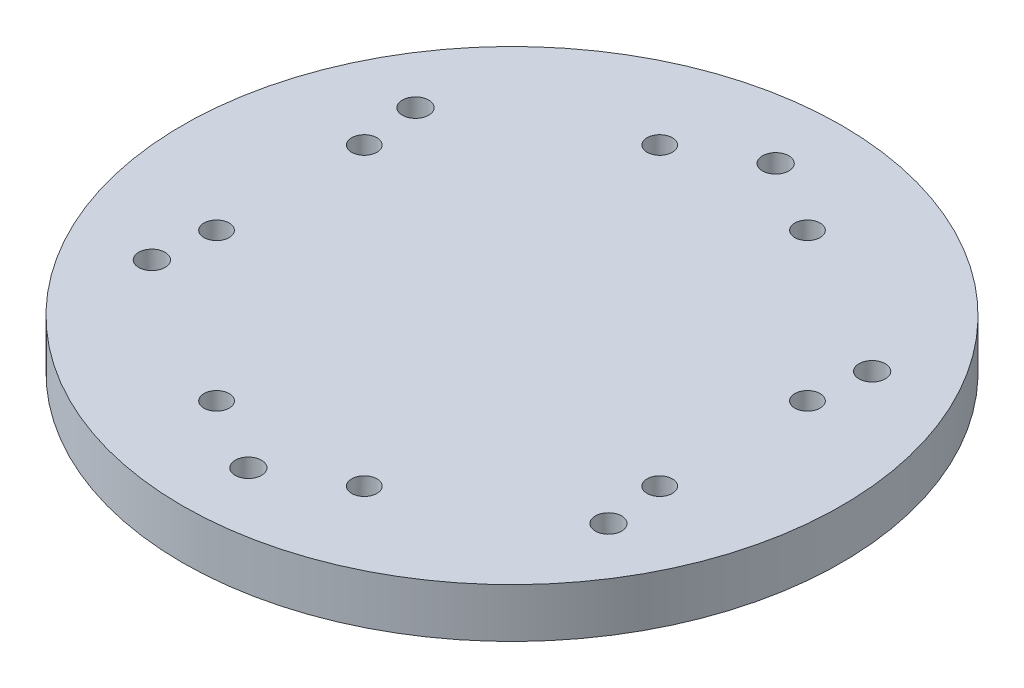
ISO-10303-21;
HEADER;
FILE_DESCRIPTION(('STEP AP214'),'2;1');
FILE_NAME('part.step','',(''),(''),'','','');
FILE_SCHEMA(('AUTOMOTIVE_DESIGN { 1 0 10303 214 1 1 1 1 }'));
ENDSEC;
DATA;
#1=APPLICATION_CONTEXT('core data for automotive mechanical design processes');
#2=APPLICATION_PROTOCOL_DEFINITION('international standard','automotive_design',2000,#1);
#3=PRODUCT_CONTEXT('',#1,'mechanical');
#4=PRODUCT('Part','Part','',(#3));
#5=PRODUCT_RELATED_PRODUCT_CATEGORY('part','',(#4));
#6=PRODUCT_DEFINITION_FORMATION('','',#4);
#7=PRODUCT_DEFINITION_CONTEXT('part definition',#1,'design');
#8=PRODUCT_DEFINITION('design','',#6,#7);
#9=PRODUCT_DEFINITION_SHAPE('','',#8);
#10=(LENGTH_UNIT() NAMED_UNIT(*) SI_UNIT(.MILLI.,.METRE.));
#11=(NAMED_UNIT(*) PLANE_ANGLE_UNIT() SI_UNIT($,.RADIAN.));
#12=(NAMED_UNIT(*) SI_UNIT($,.STERADIAN.) SOLID_ANGLE_UNIT());
#13=UNCERTAINTY_MEASURE_WITH_UNIT(LENGTH_MEASURE(1.E-05),#10,'distance_accuracy_value','');
#14=(GEOMETRIC_REPRESENTATION_CONTEXT(3) GLOBAL_UNCERTAINTY_ASSIGNED_CONTEXT((#13)) GLOBAL_UNIT_ASSIGNED_CONTEXT((#10,
#11,#12)) REPRESENTATION_CONTEXT('',''));
#15=CARTESIAN_POINT('',(0.,0.,0.));
#16=DIRECTION('',(0.,0.,1.));
#17=DIRECTION('',(1.,0.,0.));
#18=AXIS2_PLACEMENT_3D('',#15,#16,#17);
#19=CARTESIAN_POINT('',(0.,12.7,0.));
#20=DIRECTION('',(0.,1.,0.));
#21=DIRECTION('',(0.,0.,1.));
#22=AXIS2_PLACEMENT_3D('',#19,#20,#21);
#23=PLANE('',#22);
#24=CARTESIAN_POINT('',(0.,12.7,0.));
#25=DIRECTION('',(0.,1.,0.));
#26=DIRECTION('',(0.,0.,1.));
#27=AXIS2_PLACEMENT_3D('',#24,#25,#26);
#28=CIRCLE('',#27,85.);
#29=CARTESIAN_POINT('',(0.,12.7,85.));
#30=VERTEX_POINT('',#29);
#31=EDGE_CURVE('E10',#30,#30,#28,.T.);
#32=ORIENTED_EDGE('',*,*,#31,.T.);
#33=EDGE_LOOP('',(#32));
#34=FACE_BOUND('',#33,.T.);
#35=CARTESIAN_POINT('',(0.,12.7,-68.));
#36=DIRECTION('',(0.,1.,0.));
#37=DIRECTION('',(0.,0.,1.));
#38=AXIS2_PLACEMENT_3D('',#35,#36,#37);
#39=CIRCLE('',#38,3.4);
#40=CARTESIAN_POINT('',(0.,12.7,-64.6));
#41=VERTEX_POINT('',#40);
#42=EDGE_CURVE('E50',#41,#41,#39,.T.);
#43=ORIENTED_EDGE('',*,*,#42,.F.);
#44=EDGE_LOOP('',(#43));
#45=FACE_BOUND('',#44,.T.);
#46=CARTESIAN_POINT('',(58.8897274573419,12.7,-33.9999999999999));
#47=DIRECTION('',(0.,1.,0.));
#48=DIRECTION('',(-0.86602540378444,0.,0.499999999999998));
#49=AXIS2_PLACEMENT_3D('',#46,#47,#48);
#50=CIRCLE('',#49,3.4);
#51=CARTESIAN_POINT('',(55.9452410844748,12.7,-32.2999999999999));
#52=VERTEX_POINT('',#51);
#53=EDGE_CURVE('E53',#52,#52,#50,.T.);
#54=ORIENTED_EDGE('',*,*,#53,.F.);
#55=EDGE_LOOP('',(#54));
#56=FACE_BOUND('',#55,.T.);
#57=CARTESIAN_POINT('',(58.8897274573417,12.7,34.0000000000003));
#58=DIRECTION('',(0.,1.,0.));
#59=DIRECTION('',(-0.866025403784436,0.,-0.500000000000004));
#60=AXIS2_PLACEMENT_3D('',#57,#58,#59);
#61=CIRCLE('',#60,3.4);
#62=CARTESIAN_POINT('',(55.9452410844746,12.7,32.3000000000003));
#63=VERTEX_POINT('',#62);
#64=EDGE_CURVE('E59',#63,#63,#61,.T.);
#65=ORIENTED_EDGE('',*,*,#64,.F.);
#66=EDGE_LOOP('',(#65));
#67=FACE_BOUND('',#66,.T.);
#68=CARTESIAN_POINT('',(0.,12.7,68.));
#69=DIRECTION('',(0.,1.,0.));
#70=DIRECTION('',(0.,0.,-1.));
#71=AXIS2_PLACEMENT_3D('',#68,#69,#70);
#72=CIRCLE('',#71,3.4);
#73=CARTESIAN_POINT('',(0.,12.7,64.6));
#74=VERTEX_POINT('',#73);
#75=EDGE_CURVE('E74',#74,#74,#72,.T.);
#76=ORIENTED_EDGE('',*,*,#75,.F.);
#77=EDGE_LOOP('',(#76));
#78=FACE_BOUND('',#77,.T.);
#79=CARTESIAN_POINT('',(-58.8897274573421,12.7,33.9999999999995));
#80=DIRECTION('',(0.,1.,0.));
#81=DIRECTION('',(0.866025403784443,0.,-0.499999999999992));
#82=AXIS2_PLACEMENT_3D('',#79,#80,#81);
#83=CIRCLE('',#82,3.4);
#84=CARTESIAN_POINT('',(-55.945241084475,12.7,32.2999999999995));
#85=VERTEX_POINT('',#84);
#86=EDGE_CURVE('E68',#85,#85,#83,.T.);
#87=ORIENTED_EDGE('',*,*,#86,.F.);
#88=EDGE_LOOP('',(#87));
#89=FACE_BOUND('',#88,.T.);
#90=CARTESIAN_POINT('',(-58.8897274573414,12.7,-34.0000000000007));
#91=DIRECTION('',(0.,1.,0.));
#92=DIRECTION('',(0.866025403784433,0.,0.50000000000001));
#93=AXIS2_PLACEMENT_3D('',#90,#91,#92);
#94=CIRCLE('',#93,3.4);
#95=CARTESIAN_POINT('',(-55.9452410844744,12.7,-32.3000000000007));
#96=VERTEX_POINT('',#95);
#97=EDGE_CURVE('E60',#96,#96,#94,.T.);
#98=ORIENTED_EDGE('',*,*,#97,.F.);
#99=EDGE_LOOP('',(#98));
#100=FACE_BOUND('',#99,.T.);
#101=CARTESIAN_POINT('',(-19.0499999994334,12.7,-57.1499999999971));
#102=DIRECTION('',(0.,-1.,0.));
#103=DIRECTION('',(0.,0.,-1.));
#104=AXIS2_PLACEMENT_3D('',#101,#102,#103);
#105=CIRCLE('',#104,3.2639);
#106=CARTESIAN_POINT('',(-19.0499999994334,12.7,-60.4138999999971));
#107=VERTEX_POINT('',#106);
#108=EDGE_CURVE('E67',#107,#107,#105,.T.);
#109=ORIENTED_EDGE('',*,*,#108,.T.);
#110=EDGE_LOOP('',(#109));
#111=FACE_BOUND('',#110,.T.);
#112=CARTESIAN_POINT('',(19.0499999994334,12.7,-57.1499999999971));
#113=DIRECTION('',(0.,-1.,0.));
#114=DIRECTION('',(0.,0.,-1.));
#115=AXIS2_PLACEMENT_3D('',#112,#113,#114);
#116=CIRCLE('',#115,3.2639);
#117=CARTESIAN_POINT('',(19.0499999994334,12.7,-60.4138999999971));
#118=VERTEX_POINT('',#117);
#119=EDGE_CURVE('E89',#118,#118,#116,.T.);
#120=ORIENTED_EDGE('',*,*,#119,.T.);
#121=EDGE_LOOP('',(#120));
#122=FACE_BOUND('',#121,.T.);
#123=CARTESIAN_POINT('',(57.1499999999972,12.7,-19.0499999994332));
#124=DIRECTION('',(0.,-1.,0.));
#125=DIRECTION('',(0.,0.,-1.));
#126=AXIS2_PLACEMENT_3D('',#123,#124,#125);
#127=CIRCLE('',#126,3.2639);
#128=CARTESIAN_POINT('',(57.1499999999972,12.7,-22.3138999994332));
#129=VERTEX_POINT('',#128);
#130=EDGE_CURVE('E95',#129,#129,#127,.T.);
#131=ORIENTED_EDGE('',*,*,#130,.T.);
#132=EDGE_LOOP('',(#131));
#133=FACE_BOUND('',#132,.T.);
#134=CARTESIAN_POINT('',(57.1499999999971,12.7,19.0499999994336));
#135=DIRECTION('',(0.,-1.,0.));
#136=DIRECTION('',(0.,0.,-1.));
#137=AXIS2_PLACEMENT_3D('',#134,#135,#136);
#138=CIRCLE('',#137,3.2639);
#139=CARTESIAN_POINT('',(57.1499999999971,12.7,15.7860999994336));
#140=VERTEX_POINT('',#139);
#141=EDGE_CURVE('E101',#140,#140,#138,.T.);
#142=ORIENTED_EDGE('',*,*,#141,.T.);
#143=EDGE_LOOP('',(#142));
#144=FACE_BOUND('',#143,.T.);
#145=CARTESIAN_POINT('',(19.0499999994334,12.7,57.1499999999971));
#146=DIRECTION('',(0.,-1.,0.));
#147=DIRECTION('',(0.,0.,-1.));
#148=AXIS2_PLACEMENT_3D('',#145,#146,#147);
#149=CIRCLE('',#148,3.2639);
#150=CARTESIAN_POINT('',(19.0499999994334,12.7,53.8860999999971));
#151=VERTEX_POINT('',#150);
#152=EDGE_CURVE('E107',#151,#151,#149,.T.);
#153=ORIENTED_EDGE('',*,*,#152,.T.);
#154=EDGE_LOOP('',(#153));
#155=FACE_BOUND('',#154,.T.);
#156=CARTESIAN_POINT('',(-19.0499999994334,12.7,57.1499999999971));
#157=DIRECTION('',(0.,-1.,0.));
#158=DIRECTION('',(0.,0.,-1.));
#159=AXIS2_PLACEMENT_3D('',#156,#157,#158);
#160=CIRCLE('',#159,3.2639);
#161=CARTESIAN_POINT('',(-19.0499999994334,12.7,53.8860999999971));
#162=VERTEX_POINT('',#161);
#163=EDGE_CURVE('E113',#162,#162,#160,.T.);
#164=ORIENTED_EDGE('',*,*,#163,.T.);
#165=EDGE_LOOP('',(#164));
#166=FACE_BOUND('',#165,.T.);
#167=CARTESIAN_POINT('',(-57.1499999999973,12.7,19.0499999994328));
#168=DIRECTION('',(0.,-1.,0.));
#169=DIRECTION('',(0.,0.,-1.));
#170=AXIS2_PLACEMENT_3D('',#167,#168,#169);
#171=CIRCLE('',#170,3.2639);
#172=CARTESIAN_POINT('',(-57.1499999999973,12.7,15.7860999994328));
#173=VERTEX_POINT('',#172);
#174=EDGE_CURVE('E119',#173,#173,#171,.T.);
#175=ORIENTED_EDGE('',*,*,#174,.T.);
#176=EDGE_LOOP('',(#175));
#177=FACE_BOUND('',#176,.T.);
#178=CARTESIAN_POINT('',(-57.1499999999969,12.7,-19.049999999434));
#179=DIRECTION('',(0.,-1.,0.));
#180=DIRECTION('',(0.,0.,-1.));
#181=AXIS2_PLACEMENT_3D('',#178,#179,#180);
#182=CIRCLE('',#181,3.2639);
#183=CARTESIAN_POINT('',(-57.1499999999969,12.7,-22.313899999434));
#184=VERTEX_POINT('',#183);
#185=EDGE_CURVE('E125',#184,#184,#182,.T.);
#186=ORIENTED_EDGE('',*,*,#185,.T.);
#187=EDGE_LOOP('',(#186));
#188=FACE_BOUND('',#187,.T.);
#189=ADVANCED_FACE('F35',(#34,#45,#56,#67,#78,#89,#100,#111,#122,#133,#144,#155,#166,#177,#188),
#23,.T.);
#190=CARTESIAN_POINT('',(0.,0.,0.));
#191=DIRECTION('',(0.,1.,0.));
#192=DIRECTION('',(0.,0.,1.));
#193=AXIS2_PLACEMENT_3D('',#190,#191,#192);
#194=PLANE('',#193);
#195=CARTESIAN_POINT('',(-57.1499999999973,0.,19.0499999994328));
#196=DIRECTION('',(0.,-1.,0.));
#197=DIRECTION('',(0.,0.,-1.));
#198=AXIS2_PLACEMENT_3D('',#195,#196,#197);
#199=CIRCLE('',#198,3.2639);
#200=CARTESIAN_POINT('',(-57.1499999999973,0.,15.7860999994328));
#201=VERTEX_POINT('',#200);
#202=EDGE_CURVE('E122',#201,#201,#199,.T.);
#203=ORIENTED_EDGE('',*,*,#202,.F.);
#204=EDGE_LOOP('',(#203));
#205=FACE_BOUND('',#204,.T.);
#206=CARTESIAN_POINT('',(-19.0499999994334,0.,57.1499999999971));
#207=DIRECTION('',(0.,-1.,0.));
#208=DIRECTION('',(0.,0.,-1.));
#209=AXIS2_PLACEMENT_3D('',#206,#207,#208);
#210=CIRCLE('',#209,3.2639);
#211=CARTESIAN_POINT('',(-19.0499999994334,0.,53.8860999999971));
#212=VERTEX_POINT('',#211);
#213=EDGE_CURVE('E116',#212,#212,#210,.T.);
#214=ORIENTED_EDGE('',*,*,#213,.F.);
#215=EDGE_LOOP('',(#214));
#216=FACE_BOUND('',#215,.T.);
#217=CARTESIAN_POINT('',(19.0499999994334,0.,57.1499999999971));
#218=DIRECTION('',(0.,-1.,0.));
#219=DIRECTION('',(0.,0.,-1.));
#220=AXIS2_PLACEMENT_3D('',#217,#218,#219);
#221=CIRCLE('',#220,3.2639);
#222=CARTESIAN_POINT('',(19.0499999994334,0.,53.8860999999971));
#223=VERTEX_POINT('',#222);
#224=EDGE_CURVE('E110',#223,#223,#221,.T.);
#225=ORIENTED_EDGE('',*,*,#224,.F.);
#226=EDGE_LOOP('',(#225));
#227=FACE_BOUND('',#226,.T.);
#228=CARTESIAN_POINT('',(57.1499999999971,0.,19.0499999994336));
#229=DIRECTION('',(0.,-1.,0.));
#230=DIRECTION('',(0.,0.,-1.));
#231=AXIS2_PLACEMENT_3D('',#228,#229,#230);
#232=CIRCLE('',#231,3.2639);
#233=CARTESIAN_POINT('',(57.1499999999971,0.,15.7860999994336));
#234=VERTEX_POINT('',#233);
#235=EDGE_CURVE('E104',#234,#234,#232,.T.);
#236=ORIENTED_EDGE('',*,*,#235,.F.);
#237=EDGE_LOOP('',(#236));
#238=FACE_BOUND('',#237,.T.);
#239=CARTESIAN_POINT('',(57.1499999999972,0.,-19.0499999994332));
#240=DIRECTION('',(0.,-1.,0.));
#241=DIRECTION('',(0.,0.,-1.));
#242=AXIS2_PLACEMENT_3D('',#239,#240,#241);
#243=CIRCLE('',#242,3.2639);
#244=CARTESIAN_POINT('',(57.1499999999972,0.,-22.3138999994332));
#245=VERTEX_POINT('',#244);
#246=EDGE_CURVE('E98',#245,#245,#243,.T.);
#247=ORIENTED_EDGE('',*,*,#246,.F.);
#248=EDGE_LOOP('',(#247));
#249=FACE_BOUND('',#248,.T.);
#250=CARTESIAN_POINT('',(19.0499999994334,0.,-57.1499999999971));
#251=DIRECTION('',(0.,-1.,0.));
#252=DIRECTION('',(0.,0.,-1.));
#253=AXIS2_PLACEMENT_3D('',#250,#251,#252);
#254=CIRCLE('',#253,3.2639);
#255=CARTESIAN_POINT('',(19.0499999994334,0.,-60.4138999999971));
#256=VERTEX_POINT('',#255);
#257=EDGE_CURVE('E92',#256,#256,#254,.T.);
#258=ORIENTED_EDGE('',*,*,#257,.F.);
#259=EDGE_LOOP('',(#258));
#260=FACE_BOUND('',#259,.T.);
#261=CARTESIAN_POINT('',(-19.0499999994334,0.,-57.1499999999971));
#262=DIRECTION('',(0.,-1.,0.));
#263=DIRECTION('',(0.,0.,-1.));
#264=AXIS2_PLACEMENT_3D('',#261,#262,#263);
#265=CIRCLE('',#264,3.2639);
#266=CARTESIAN_POINT('',(-19.0499999994334,0.,-60.4138999999971));
#267=VERTEX_POINT('',#266);
#268=EDGE_CURVE('E86',#267,#267,#265,.T.);
#269=ORIENTED_EDGE('',*,*,#268,.F.);
#270=EDGE_LOOP('',(#269));
#271=FACE_BOUND('',#270,.T.);
#272=CARTESIAN_POINT('',(-58.8897274573414,0.,-34.0000000000007));
#273=DIRECTION('',(0.,1.,0.));
#274=DIRECTION('',(0.866025403784433,0.,0.50000000000001));
#275=AXIS2_PLACEMENT_3D('',#272,#273,#274);
#276=CIRCLE('',#275,3.4);
#277=CARTESIAN_POINT('',(-55.9452410844744,0.,-32.3000000000007));
#278=VERTEX_POINT('',#277);
#279=EDGE_CURVE('E64',#278,#278,#276,.T.);
#280=ORIENTED_EDGE('',*,*,#279,.T.);
#281=EDGE_LOOP('',(#280));
#282=FACE_BOUND('',#281,.T.);
#283=CARTESIAN_POINT('',(-58.8897274573421,0.,33.9999999999995));
#284=DIRECTION('',(0.,1.,0.));
#285=DIRECTION('',(0.866025403784443,0.,-0.499999999999992));
#286=AXIS2_PLACEMENT_3D('',#283,#284,#285);
#287=CIRCLE('',#286,3.4);
#288=CARTESIAN_POINT('',(-55.945241084475,0.,32.2999999999995));
#289=VERTEX_POINT('',#288);
#290=EDGE_CURVE('E63',#289,#289,#287,.T.);
#291=ORIENTED_EDGE('',*,*,#290,.T.);
#292=EDGE_LOOP('',(#291));
#293=FACE_BOUND('',#292,.T.);
#294=CARTESIAN_POINT('',(0.,0.,68.));
#295=DIRECTION('',(0.,1.,0.));
#296=DIRECTION('',(0.,0.,-1.));
#297=AXIS2_PLACEMENT_3D('',#294,#295,#296);
#298=CIRCLE('',#297,3.4);
#299=CARTESIAN_POINT('',(0.,0.,64.6));
#300=VERTEX_POINT('',#299);
#301=EDGE_CURVE('E71',#300,#300,#298,.T.);
#302=ORIENTED_EDGE('',*,*,#301,.T.);
#303=EDGE_LOOP('',(#302));
#304=FACE_BOUND('',#303,.T.);
#305=CARTESIAN_POINT('',(58.8897274573417,0.,34.0000000000003));
#306=DIRECTION('',(0.,1.,0.));
#307=DIRECTION('',(-0.866025403784436,0.,-0.500000000000004));
#308=AXIS2_PLACEMENT_3D('',#305,#306,#307);
#309=CIRCLE('',#308,3.4);
#310=CARTESIAN_POINT('',(55.9452410844746,0.,32.3000000000003));
#311=VERTEX_POINT('',#310);
#312=EDGE_CURVE('E77',#311,#311,#309,.T.);
#313=ORIENTED_EDGE('',*,*,#312,.T.);
#314=EDGE_LOOP('',(#313));
#315=FACE_BOUND('',#314,.T.);
#316=CARTESIAN_POINT('',(58.8897274573419,0.,-33.9999999999999));
#317=DIRECTION('',(0.,1.,0.));
#318=DIRECTION('',(-0.86602540378444,0.,0.499999999999998));
#319=AXIS2_PLACEMENT_3D('',#316,#317,#318);
#320=CIRCLE('',#319,3.4);
#321=CARTESIAN_POINT('',(55.9452410844748,0.,-32.2999999999999));
#322=VERTEX_POINT('',#321);
#323=EDGE_CURVE('E56',#322,#322,#320,.T.);
#324=ORIENTED_EDGE('',*,*,#323,.T.);
#325=EDGE_LOOP('',(#324));
#326=FACE_BOUND('',#325,.T.);
#327=CARTESIAN_POINT('',(0.,0.,-68.));
#328=DIRECTION('',(0.,1.,0.));
#329=DIRECTION('',(0.,0.,1.));
#330=AXIS2_PLACEMENT_3D('',#327,#328,#329);
#331=CIRCLE('',#330,3.4);
#332=CARTESIAN_POINT('',(0.,0.,-64.6));
#333=VERTEX_POINT('',#332);
#334=EDGE_CURVE('E46',#333,#333,#331,.T.);
#335=ORIENTED_EDGE('',*,*,#334,.T.);
#336=EDGE_LOOP('',(#335));
#337=FACE_BOUND('',#336,.T.);
#338=CARTESIAN_POINT('',(0.,0.,0.));
#339=DIRECTION('',(0.,1.,0.));
#340=DIRECTION('',(0.,0.,1.));
#341=AXIS2_PLACEMENT_3D('',#338,#339,#340);
#342=CIRCLE('',#341,85.);
#343=CARTESIAN_POINT('',(0.,0.,85.));
#344=VERTEX_POINT('',#343);
#345=EDGE_CURVE('E39',#344,#344,#342,.T.);
#346=ORIENTED_EDGE('',*,*,#345,.F.);
#347=EDGE_LOOP('',(#346));
#348=FACE_BOUND('',#347,.T.);
#349=CARTESIAN_POINT('',(-57.1499999999969,0.,-19.049999999434));
#350=DIRECTION('',(0.,-1.,0.));
#351=DIRECTION('',(0.,0.,-1.));
#352=AXIS2_PLACEMENT_3D('',#349,#350,#351);
#353=CIRCLE('',#352,3.2639);
#354=CARTESIAN_POINT('',(-57.1499999999969,0.,-22.313899999434));
#355=VERTEX_POINT('',#354);
#356=EDGE_CURVE('E128',#355,#355,#353,.T.);
#357=ORIENTED_EDGE('',*,*,#356,.F.);
#358=EDGE_LOOP('',(#357));
#359=FACE_BOUND('',#358,.T.);
#360=ADVANCED_FACE('F134',(#205,#216,#227,#238,#249,#260,#271,#282,#293,#304,#315,#326,#337,
#348,#359),#194,.F.);
#361=CARTESIAN_POINT('',(0.,12.7,0.));
#362=DIRECTION('',(0.,-1.,0.));
#363=DIRECTION('',(0.,0.,-1.));
#364=AXIS2_PLACEMENT_3D('',#361,#362,#363);
#365=CYLINDRICAL_SURFACE('',#364,85.);
#366=ORIENTED_EDGE('',*,*,#31,.F.);
#367=EDGE_LOOP('',(#366));
#368=FACE_BOUND('',#367,.T.);
#369=ORIENTED_EDGE('',*,*,#345,.T.);
#370=EDGE_LOOP('',(#369));
#371=FACE_BOUND('',#370,.T.);
#372=ADVANCED_FACE('F37',(#368,#371),#365,.T.);
#373=CARTESIAN_POINT('',(0.,12.7,-68.));
#374=DIRECTION('',(0.,1.,0.));
#375=DIRECTION('',(0.,0.,1.));
#376=AXIS2_PLACEMENT_3D('',#373,#374,#375);
#377=CYLINDRICAL_SURFACE('',#376,3.4);
#378=ORIENTED_EDGE('',*,*,#334,.F.);
#379=EDGE_LOOP('',(#378));
#380=FACE_BOUND('',#379,.T.);
#381=ORIENTED_EDGE('',*,*,#42,.T.);
#382=EDGE_LOOP('',(#381));
#383=FACE_BOUND('',#382,.T.);
#384=ADVANCED_FACE('F141',(#380,#383),#377,.F.);
#385=CARTESIAN_POINT('',(58.8897274573419,12.7,-33.9999999999999));
#386=DIRECTION('',(0.,1.,0.));
#387=DIRECTION('',(-0.86602540378444,0.,0.499999999999998));
#388=AXIS2_PLACEMENT_3D('',#385,#386,#387);
#389=CYLINDRICAL_SURFACE('',#388,3.4);
#390=ORIENTED_EDGE('',*,*,#323,.F.);
#391=EDGE_LOOP('',(#390));
#392=FACE_BOUND('',#391,.T.);
#393=ORIENTED_EDGE('',*,*,#53,.T.);
#394=EDGE_LOOP('',(#393));
#395=FACE_BOUND('',#394,.T.);
#396=ADVANCED_FACE('F149',(#392,#395),#389,.F.);
#397=CARTESIAN_POINT('',(58.8897274573417,12.7,34.0000000000003));
#398=DIRECTION('',(0.,1.,0.));
#399=DIRECTION('',(-0.866025403784436,0.,-0.500000000000004));
#400=AXIS2_PLACEMENT_3D('',#397,#398,#399);
#401=CYLINDRICAL_SURFACE('',#400,3.4);
#402=ORIENTED_EDGE('',*,*,#312,.F.);
#403=EDGE_LOOP('',(#402));
#404=FACE_BOUND('',#403,.T.);
#405=ORIENTED_EDGE('',*,*,#64,.T.);
#406=EDGE_LOOP('',(#405));
#407=FACE_BOUND('',#406,.T.);
#408=ADVANCED_FACE('F153',(#404,#407),#401,.F.);
#409=CARTESIAN_POINT('',(0.,12.7,68.));
#410=DIRECTION('',(0.,1.,0.));
#411=DIRECTION('',(0.,0.,-1.));
#412=AXIS2_PLACEMENT_3D('',#409,#410,#411);
#413=CYLINDRICAL_SURFACE('',#412,3.4);
#414=ORIENTED_EDGE('',*,*,#301,.F.);
#415=EDGE_LOOP('',(#414));
#416=FACE_BOUND('',#415,.T.);
#417=ORIENTED_EDGE('',*,*,#75,.T.);
#418=EDGE_LOOP('',(#417));
#419=FACE_BOUND('',#418,.T.);
#420=ADVANCED_FACE('F163',(#416,#419),#413,.F.);
#421=CARTESIAN_POINT('',(-58.8897274573421,12.7,33.9999999999995));
#422=DIRECTION('',(0.,1.,0.));
#423=DIRECTION('',(0.866025403784443,0.,-0.499999999999992));
#424=AXIS2_PLACEMENT_3D('',#421,#422,#423);
#425=CYLINDRICAL_SURFACE('',#424,3.4);
#426=ORIENTED_EDGE('',*,*,#290,.F.);
#427=EDGE_LOOP('',(#426));
#428=FACE_BOUND('',#427,.T.);
#429=ORIENTED_EDGE('',*,*,#86,.T.);
#430=EDGE_LOOP('',(#429));
#431=FACE_BOUND('',#430,.T.);
#432=ADVANCED_FACE('F159',(#428,#431),#425,.F.);
#433=CARTESIAN_POINT('',(-58.8897274573414,12.7,-34.0000000000007));
#434=DIRECTION('',(0.,1.,0.));
#435=DIRECTION('',(0.866025403784433,0.,0.50000000000001));
#436=AXIS2_PLACEMENT_3D('',#433,#434,#435);
#437=CYLINDRICAL_SURFACE('',#436,3.4);
#438=ORIENTED_EDGE('',*,*,#279,.F.);
#439=EDGE_LOOP('',(#438));
#440=FACE_BOUND('',#439,.T.);
#441=ORIENTED_EDGE('',*,*,#97,.T.);
#442=EDGE_LOOP('',(#441));
#443=FACE_BOUND('',#442,.T.);
#444=ADVANCED_FACE('F155',(#440,#443),#437,.F.);
#445=CARTESIAN_POINT('',(-19.0499999994334,0.,-57.1499999999971));
#446=DIRECTION('',(0.,-1.,0.));
#447=DIRECTION('',(0.,0.,-1.));
#448=AXIS2_PLACEMENT_3D('',#445,#446,#447);
#449=CYLINDRICAL_SURFACE('',#448,3.2639);
#450=ORIENTED_EDGE('',*,*,#108,.F.);
#451=EDGE_LOOP('',(#450));
#452=FACE_BOUND('',#451,.T.);
#453=ORIENTED_EDGE('',*,*,#268,.T.);
#454=EDGE_LOOP('',(#453));
#455=FACE_BOUND('',#454,.T.);
#456=ADVANCED_FACE('F158',(#452,#455),#449,.F.);
#457=CARTESIAN_POINT('',(19.0499999994334,0.,-57.1499999999971));
#458=DIRECTION('',(0.,-1.,0.));
#459=DIRECTION('',(0.,0.,-1.));
#460=AXIS2_PLACEMENT_3D('',#457,#458,#459);
#461=CYLINDRICAL_SURFACE('',#460,3.2639);
#462=ORIENTED_EDGE('',*,*,#119,.F.);
#463=EDGE_LOOP('',(#462));
#464=FACE_BOUND('',#463,.T.);
#465=ORIENTED_EDGE('',*,*,#257,.T.);
#466=EDGE_LOOP('',(#465));
#467=FACE_BOUND('',#466,.T.);
#468=ADVANCED_FACE('F173',(#464,#467),#461,.F.);
#469=CARTESIAN_POINT('',(57.1499999999972,0.,-19.0499999994332));
#470=DIRECTION('',(0.,-1.,0.));
#471=DIRECTION('',(0.,0.,-1.));
#472=AXIS2_PLACEMENT_3D('',#469,#470,#471);
#473=CYLINDRICAL_SURFACE('',#472,3.2639);
#474=ORIENTED_EDGE('',*,*,#130,.F.);
#475=EDGE_LOOP('',(#474));
#476=FACE_BOUND('',#475,.T.);
#477=ORIENTED_EDGE('',*,*,#246,.T.);
#478=EDGE_LOOP('',(#477));
#479=FACE_BOUND('',#478,.T.);
#480=ADVANCED_FACE('F177',(#476,#479),#473,.F.);
#481=CARTESIAN_POINT('',(57.1499999999971,0.,19.0499999994336));
#482=DIRECTION('',(0.,-1.,0.));
#483=DIRECTION('',(0.,0.,-1.));
#484=AXIS2_PLACEMENT_3D('',#481,#482,#483);
#485=CYLINDRICAL_SURFACE('',#484,3.2639);
#486=ORIENTED_EDGE('',*,*,#141,.F.);
#487=EDGE_LOOP('',(#486));
#488=FACE_BOUND('',#487,.T.);
#489=ORIENTED_EDGE('',*,*,#235,.T.);
#490=EDGE_LOOP('',(#489));
#491=FACE_BOUND('',#490,.T.);
#492=ADVANCED_FACE('F181',(#488,#491),#485,.F.);
#493=CARTESIAN_POINT('',(19.0499999994334,0.,57.1499999999971));
#494=DIRECTION('',(0.,-1.,0.));
#495=DIRECTION('',(0.,0.,-1.));
#496=AXIS2_PLACEMENT_3D('',#493,#494,#495);
#497=CYLINDRICAL_SURFACE('',#496,3.2639);
#498=ORIENTED_EDGE('',*,*,#152,.F.);
#499=EDGE_LOOP('',(#498));
#500=FACE_BOUND('',#499,.T.);
#501=ORIENTED_EDGE('',*,*,#224,.T.);
#502=EDGE_LOOP('',(#501));
#503=FACE_BOUND('',#502,.T.);
#504=ADVANCED_FACE('F185',(#500,#503),#497,.F.);
#505=CARTESIAN_POINT('',(-19.0499999994334,0.,57.1499999999971));
#506=DIRECTION('',(0.,-1.,0.));
#507=DIRECTION('',(0.,0.,-1.));
#508=AXIS2_PLACEMENT_3D('',#505,#506,#507);
#509=CYLINDRICAL_SURFACE('',#508,3.2639);
#510=ORIENTED_EDGE('',*,*,#163,.F.);
#511=EDGE_LOOP('',(#510));
#512=FACE_BOUND('',#511,.T.);
#513=ORIENTED_EDGE('',*,*,#213,.T.);
#514=EDGE_LOOP('',(#513));
#515=FACE_BOUND('',#514,.T.);
#516=ADVANCED_FACE('F189',(#512,#515),#509,.F.);
#517=CARTESIAN_POINT('',(-57.1499999999973,0.,19.0499999994328));
#518=DIRECTION('',(0.,-1.,0.));
#519=DIRECTION('',(0.,0.,-1.));
#520=AXIS2_PLACEMENT_3D('',#517,#518,#519);
#521=CYLINDRICAL_SURFACE('',#520,3.2639);
#522=ORIENTED_EDGE('',*,*,#174,.F.);
#523=EDGE_LOOP('',(#522));
#524=FACE_BOUND('',#523,.T.);
#525=ORIENTED_EDGE('',*,*,#202,.T.);
#526=EDGE_LOOP('',(#525));
#527=FACE_BOUND('',#526,.T.);
#528=ADVANCED_FACE('F193',(#524,#527),#521,.F.);
#529=CARTESIAN_POINT('',(-57.1499999999969,0.,-19.049999999434));
#530=DIRECTION('',(0.,-1.,0.));
#531=DIRECTION('',(0.,0.,-1.));
#532=AXIS2_PLACEMENT_3D('',#529,#530,#531);
#533=CYLINDRICAL_SURFACE('',#532,3.2639);
#534=ORIENTED_EDGE('',*,*,#185,.F.);
#535=EDGE_LOOP('',(#534));
#536=FACE_BOUND('',#535,.T.);
#537=ORIENTED_EDGE('',*,*,#356,.T.);
#538=EDGE_LOOP('',(#537));
#539=FACE_BOUND('',#538,.T.);
#540=ADVANCED_FACE('F132',(#536,#539),#533,.F.);
#541=CLOSED_SHELL('',(#189,#360,#372,#384,#396,#408,#420,#432,#444,#456,#468,#480,#492,#504,
#516,#528,#540));
#542=MANIFOLD_SOLID_BREP('B2',#541);
#543=ADVANCED_BREP_SHAPE_REPRESENTATION('',(#18,#542),#14);
#544=SHAPE_DEFINITION_REPRESENTATION(#9,#543);
ENDSEC;
END-ISO-10303-21;
